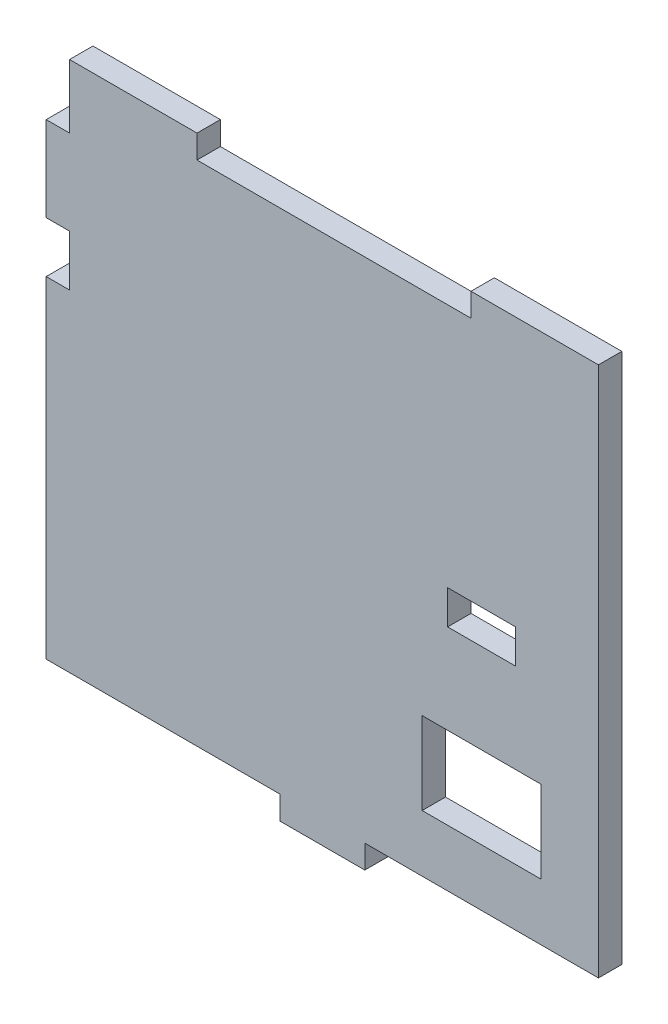
ISO-10303-21;
HEADER;
FILE_DESCRIPTION(('STEP AP214'),'2;1');
FILE_NAME('part.step','',(''),(''),'','','');
FILE_SCHEMA(('AUTOMOTIVE_DESIGN { 1 0 10303 214 1 1 1 1 }'));
ENDSEC;
DATA;
#1=APPLICATION_CONTEXT('core data for automotive mechanical design processes');
#2=APPLICATION_PROTOCOL_DEFINITION('international standard','automotive_design',2000,#1);
#3=PRODUCT_CONTEXT('',#1,'mechanical');
#4=PRODUCT('Part','Part','',(#3));
#5=PRODUCT_RELATED_PRODUCT_CATEGORY('part','',(#4));
#6=PRODUCT_DEFINITION_FORMATION('','',#4);
#7=PRODUCT_DEFINITION_CONTEXT('part definition',#1,'design');
#8=PRODUCT_DEFINITION('design','',#6,#7);
#9=PRODUCT_DEFINITION_SHAPE('','',#8);
#10=(LENGTH_UNIT() NAMED_UNIT(*) SI_UNIT(.MILLI.,.METRE.));
#11=(NAMED_UNIT(*) PLANE_ANGLE_UNIT() SI_UNIT($,.RADIAN.));
#12=(NAMED_UNIT(*) SI_UNIT($,.STERADIAN.) SOLID_ANGLE_UNIT());
#13=UNCERTAINTY_MEASURE_WITH_UNIT(LENGTH_MEASURE(1.E-05),#10,'distance_accuracy_value','');
#14=(GEOMETRIC_REPRESENTATION_CONTEXT(3) GLOBAL_UNCERTAINTY_ASSIGNED_CONTEXT((#13)) GLOBAL_UNIT_ASSIGNED_CONTEXT((#10,
#11,#12)) REPRESENTATION_CONTEXT('',''));
#15=CARTESIAN_POINT('',(0.,0.,0.));
#16=DIRECTION('',(0.,0.,1.));
#17=DIRECTION('',(1.,0.,0.));
#18=AXIS2_PLACEMENT_3D('',#15,#16,#17);
#19=CARTESIAN_POINT('',(0.,0.,5.5));
#20=DIRECTION('',(0.,0.,-1.));
#21=DIRECTION('',(-1.,0.,0.));
#22=AXIS2_PLACEMENT_3D('',#19,#20,#21);
#23=PLANE('',#22);
#24=DIRECTION('',(1.,0.,0.));
#25=VECTOR('',#24,1.);
#26=CARTESIAN_POINT('',(448.516438709158,17.4332232029367,5.5));
#27=LINE('',#26,#25);
#28=CARTESIAN_POINT('',(432.516438709158,17.4332232029367,5.5));
#29=VERTEX_POINT('',#28);
#30=CARTESIAN_POINT('',(448.516438709158,17.4332232029367,5.5));
#31=VERTEX_POINT('',#30);
#32=EDGE_CURVE('E242',#29,#31,#27,.T.);
#33=ORIENTED_EDGE('',*,*,#32,.F.);
#34=DIRECTION('',(0.,-1.,0.));
#35=VECTOR('',#34,1.);
#36=CARTESIAN_POINT('',(432.516438709158,17.4332232029367,5.5));
#37=LINE('',#36,#35);
#38=CARTESIAN_POINT('',(432.516438709158,25.4332232029367,5.5));
#39=VERTEX_POINT('',#38);
#40=EDGE_CURVE('E250',#39,#29,#37,.T.);
#41=ORIENTED_EDGE('',*,*,#40,.F.);
#42=DIRECTION('',(-1.,0.,0.));
#43=VECTOR('',#42,1.);
#44=CARTESIAN_POINT('',(432.516438709158,25.4332232029367,5.5));
#45=LINE('',#44,#43);
#46=CARTESIAN_POINT('',(448.516438709158,25.4332232029367,5.5));
#47=VERTEX_POINT('',#46);
#48=EDGE_CURVE('E247',#47,#39,#45,.T.);
#49=ORIENTED_EDGE('',*,*,#48,.F.);
#50=DIRECTION('',(0.,1.,0.));
#51=VECTOR('',#50,1.);
#52=CARTESIAN_POINT('',(448.516438709158,25.4332232029367,5.5));
#53=LINE('',#52,#51);
#54=EDGE_CURVE('E244',#31,#47,#53,.T.);
#55=ORIENTED_EDGE('',*,*,#54,.F.);
#56=EDGE_LOOP('',(#33,#41,#49,#55));
#57=FACE_BOUND('',#56,.T.);
#58=DIRECTION('',(0.,-1.,0.));
#59=VECTOR('',#58,1.);
#60=CARTESIAN_POINT('',(393.016438709158,-41.8917707150965,5.5));
#61=LINE('',#60,#59);
#62=CARTESIAN_POINT('',(393.016438709158,-36.3917707150965,5.5));
#63=VERTEX_POINT('',#62);
#64=CARTESIAN_POINT('',(393.016438709158,-41.8917707150965,5.5));
#65=VERTEX_POINT('',#64);
#66=EDGE_CURVE('E273',#63,#65,#61,.T.);
#67=ORIENTED_EDGE('',*,*,#66,.T.);
#68=DIRECTION('',(1.,0.,0.));
#69=VECTOR('',#68,1.);
#70=CARTESIAN_POINT('',(413.016438709158,-41.8917707150965,5.5));
#71=LINE('',#70,#69);
#72=CARTESIAN_POINT('',(413.016438709158,-41.8917707150965,5.5));
#73=VERTEX_POINT('',#72);
#74=EDGE_CURVE('E276',#65,#73,#71,.T.);
#75=ORIENTED_EDGE('',*,*,#74,.T.);
#76=DIRECTION('',(0.,1.,0.));
#77=VECTOR('',#76,1.);
#78=CARTESIAN_POINT('',(413.016438709158,-41.8917707150965,5.5));
#79=LINE('',#78,#77);
#80=CARTESIAN_POINT('',(413.016438709158,-36.3917707150965,5.5));
#81=VERTEX_POINT('',#80);
#82=EDGE_CURVE('E279',#73,#81,#79,.T.);
#83=ORIENTED_EDGE('',*,*,#82,.T.);
#84=DIRECTION('',(1.,0.,0.));
#85=VECTOR('',#84,1.);
#86=CARTESIAN_POINT('',(413.016438709158,-36.3917707150965,5.5));
#87=LINE('',#86,#85);
#88=CARTESIAN_POINT('',(468.016438709158,-36.3917707150965,5.5));
#89=VERTEX_POINT('',#88);
#90=EDGE_CURVE('E281',#81,#89,#87,.T.);
#91=ORIENTED_EDGE('',*,*,#90,.T.);
#92=DIRECTION('',(0.,1.,0.));
#93=VECTOR('',#92,1.);
#94=CARTESIAN_POINT('',(468.016438709158,88.6082292849035,5.5));
#95=LINE('',#94,#93);
#96=CARTESIAN_POINT('',(468.016438709158,88.6082292849035,5.5));
#97=VERTEX_POINT('',#96);
#98=EDGE_CURVE('E283',#89,#97,#95,.T.);
#99=ORIENTED_EDGE('',*,*,#98,.T.);
#100=DIRECTION('',(-1.,0.,0.));
#101=VECTOR('',#100,1.);
#102=CARTESIAN_POINT('',(438.016438709159,88.6082292849035,5.5));
#103=LINE('',#102,#101);
#104=CARTESIAN_POINT('',(438.016438709159,88.6082292849035,5.5));
#105=VERTEX_POINT('',#104);
#106=EDGE_CURVE('E285',#97,#105,#103,.T.);
#107=ORIENTED_EDGE('',*,*,#106,.T.);
#108=DIRECTION('',(0.,-1.,0.));
#109=VECTOR('',#108,1.);
#110=CARTESIAN_POINT('',(438.016438709159,83.1082292849035,5.5));
#111=LINE('',#110,#109);
#112=CARTESIAN_POINT('',(438.016438709159,83.1082292849035,5.5));
#113=VERTEX_POINT('',#112);
#114=EDGE_CURVE('E287',#105,#113,#111,.T.);
#115=ORIENTED_EDGE('',*,*,#114,.T.);
#116=DIRECTION('',(-1.,0.,0.));
#117=VECTOR('',#116,1.);
#118=CARTESIAN_POINT('',(438.016438709159,83.1082292849035,5.5));
#119=LINE('',#118,#117);
#120=CARTESIAN_POINT('',(373.516438709158,83.1082292849035,5.5));
#121=VERTEX_POINT('',#120);
#122=EDGE_CURVE('E289',#113,#121,#119,.T.);
#123=ORIENTED_EDGE('',*,*,#122,.T.);
#124=DIRECTION('',(0.,1.,0.));
#125=VECTOR('',#124,1.);
#126=CARTESIAN_POINT('',(373.516438709158,83.1082292849035,5.5));
#127=LINE('',#126,#125);
#128=CARTESIAN_POINT('',(373.516438709158,88.6082292849035,5.5));
#129=VERTEX_POINT('',#128);
#130=EDGE_CURVE('E291',#121,#129,#127,.T.);
#131=ORIENTED_EDGE('',*,*,#130,.T.);
#132=DIRECTION('',(-1.,0.,0.));
#133=VECTOR('',#132,1.);
#134=CARTESIAN_POINT('',(343.516438709158,88.6082292849035,5.5));
#135=LINE('',#134,#133);
#136=CARTESIAN_POINT('',(343.516438709158,88.6082292849035,5.5));
#137=VERTEX_POINT('',#136);
#138=EDGE_CURVE('E293',#129,#137,#135,.T.);
#139=ORIENTED_EDGE('',*,*,#138,.T.);
#140=DIRECTION('',(0.,-1.,0.));
#141=VECTOR('',#140,1.);
#142=CARTESIAN_POINT('',(343.516438709158,73.6082292849035,5.5));
#143=LINE('',#142,#141);
#144=CARTESIAN_POINT('',(343.516438709158,73.6082292849035,5.5));
#145=VERTEX_POINT('',#144);
#146=EDGE_CURVE('E295',#137,#145,#143,.T.);
#147=ORIENTED_EDGE('',*,*,#146,.T.);
#148=DIRECTION('',(-1.,0.,0.));
#149=VECTOR('',#148,1.);
#150=CARTESIAN_POINT('',(338.016438709158,73.6082292849035,5.5));
#151=LINE('',#150,#149);
#152=CARTESIAN_POINT('',(338.016438709158,73.6082292849035,5.5));
#153=VERTEX_POINT('',#152);
#154=EDGE_CURVE('E297',#145,#153,#151,.T.);
#155=ORIENTED_EDGE('',*,*,#154,.T.);
#156=DIRECTION('',(0.,-1.,0.));
#157=VECTOR('',#156,1.);
#158=CARTESIAN_POINT('',(338.016438709158,73.6082292849035,5.5));
#159=LINE('',#158,#157);
#160=CARTESIAN_POINT('',(338.016438709158,53.6082292849035,5.5));
#161=VERTEX_POINT('',#160);
#162=EDGE_CURVE('E299',#153,#161,#159,.T.);
#163=ORIENTED_EDGE('',*,*,#162,.T.);
#164=DIRECTION('',(1.,0.,0.));
#165=VECTOR('',#164,1.);
#166=CARTESIAN_POINT('',(338.016438709158,53.6082292849035,5.5));
#167=LINE('',#166,#165);
#168=CARTESIAN_POINT('',(343.516438709158,53.6082292849035,5.5));
#169=VERTEX_POINT('',#168);
#170=EDGE_CURVE('E301',#161,#169,#167,.T.);
#171=ORIENTED_EDGE('',*,*,#170,.T.);
#172=DIRECTION('',(0.,-1.,0.));
#173=VECTOR('',#172,1.);
#174=CARTESIAN_POINT('',(343.516438709158,53.6082292849035,5.5));
#175=LINE('',#174,#173);
#176=CARTESIAN_POINT('',(343.516438709158,41.6082292849035,5.5));
#177=VERTEX_POINT('',#176);
#178=EDGE_CURVE('E303',#169,#177,#175,.T.);
#179=ORIENTED_EDGE('',*,*,#178,.T.);
#180=DIRECTION('',(-1.,0.,0.));
#181=VECTOR('',#180,1.);
#182=CARTESIAN_POINT('',(343.516438709158,41.6082292849035,5.5));
#183=LINE('',#182,#181);
#184=CARTESIAN_POINT('',(338.016438709158,41.6082292849035,5.5));
#185=VERTEX_POINT('',#184);
#186=EDGE_CURVE('E305',#177,#185,#183,.T.);
#187=ORIENTED_EDGE('',*,*,#186,.T.);
#188=DIRECTION('',(0.,-1.,0.));
#189=VECTOR('',#188,1.);
#190=CARTESIAN_POINT('',(338.016438709158,41.6082292849035,5.5));
#191=LINE('',#190,#189);
#192=CARTESIAN_POINT('',(338.016438709158,-36.3917707150965,5.5));
#193=VERTEX_POINT('',#192);
#194=EDGE_CURVE('E307',#185,#193,#191,.T.);
#195=ORIENTED_EDGE('',*,*,#194,.T.);
#196=DIRECTION('',(1.,0.,0.));
#197=VECTOR('',#196,1.);
#198=CARTESIAN_POINT('',(338.016438709158,-36.3917707150965,5.5));
#199=LINE('',#198,#197);
#200=EDGE_CURVE('E309',#193,#63,#199,.T.);
#201=ORIENTED_EDGE('',*,*,#200,.T.);
#202=EDGE_LOOP('',(#67,#75,#83,#91,#99,#107,#115,#123,#131,#139,#147,#155,#163,#171,#179,#187,
#195,#201));
#203=FACE_BOUND('',#202,.T.);
#204=DIRECTION('',(0.,-1.,0.));
#205=VECTOR('',#204,1.);
#206=CARTESIAN_POINT('',(426.516438709158,-3.65,5.5));
#207=LINE('',#206,#205);
#208=CARTESIAN_POINT('',(426.516438709158,-3.65,5.5));
#209=VERTEX_POINT('',#208);
#210=CARTESIAN_POINT('',(426.516438709158,-23.,5.5));
#211=VERTEX_POINT('',#210);
#212=EDGE_CURVE('E206',#209,#211,#207,.T.);
#213=ORIENTED_EDGE('',*,*,#212,.F.);
#214=DIRECTION('',(-1.,0.,0.));
#215=VECTOR('',#214,1.);
#216=CARTESIAN_POINT('',(426.516438709158,-3.65,5.5));
#217=LINE('',#216,#215);
#218=CARTESIAN_POINT('',(454.516438709158,-3.65,5.5));
#219=VERTEX_POINT('',#218);
#220=EDGE_CURVE('E228',#219,#209,#217,.T.);
#221=ORIENTED_EDGE('',*,*,#220,.F.);
#222=DIRECTION('',(0.,1.,0.));
#223=VECTOR('',#222,1.);
#224=CARTESIAN_POINT('',(454.516438709158,-23.,5.5));
#225=LINE('',#224,#223);
#226=CARTESIAN_POINT('',(454.516438709158,-23.,5.5));
#227=VERTEX_POINT('',#226);
#228=EDGE_CURVE('E226',#227,#219,#225,.T.);
#229=ORIENTED_EDGE('',*,*,#228,.F.);
#230=DIRECTION('',(1.,0.,0.));
#231=VECTOR('',#230,1.);
#232=CARTESIAN_POINT('',(426.516438709158,-23.,5.5));
#233=LINE('',#232,#231);
#234=EDGE_CURVE('E214',#211,#227,#233,.T.);
#235=ORIENTED_EDGE('',*,*,#234,.F.);
#236=EDGE_LOOP('',(#213,#221,#229,#235));
#237=FACE_BOUND('',#236,.T.);
#238=ADVANCED_FACE('F33',(#57,#203,#237),#23,.F.);
#239=CARTESIAN_POINT('',(0.,0.,0.));
#240=DIRECTION('',(0.,0.,-1.));
#241=DIRECTION('',(-1.,0.,0.));
#242=AXIS2_PLACEMENT_3D('',#239,#240,#241);
#243=PLANE('',#242);
#244=DIRECTION('',(0.,-1.,0.));
#245=VECTOR('',#244,1.);
#246=CARTESIAN_POINT('',(393.016438709158,-41.8917707150965,0.));
#247=LINE('',#246,#245);
#248=CARTESIAN_POINT('',(393.016438709158,-36.3917707150965,0.));
#249=VERTEX_POINT('',#248);
#250=CARTESIAN_POINT('',(393.016438709158,-41.8917707150965,0.));
#251=VERTEX_POINT('',#250);
#252=EDGE_CURVE('E272',#249,#251,#247,.T.);
#253=ORIENTED_EDGE('',*,*,#252,.F.);
#254=DIRECTION('',(1.,0.,0.));
#255=VECTOR('',#254,1.);
#256=CARTESIAN_POINT('',(338.016438709158,-36.3917707150965,0.));
#257=LINE('',#256,#255);
#258=CARTESIAN_POINT('',(338.016438709158,-36.3917707150965,0.));
#259=VERTEX_POINT('',#258);
#260=EDGE_CURVE('E277',#259,#249,#257,.T.);
#261=ORIENTED_EDGE('',*,*,#260,.F.);
#262=DIRECTION('',(0.,-1.,0.));
#263=VECTOR('',#262,1.);
#264=CARTESIAN_POINT('',(338.016438709158,41.6082292849035,0.));
#265=LINE('',#264,#263);
#266=CARTESIAN_POINT('',(338.016438709158,41.6082292849035,0.));
#267=VERTEX_POINT('',#266);
#268=EDGE_CURVE('E344',#267,#259,#265,.T.);
#269=ORIENTED_EDGE('',*,*,#268,.F.);
#270=DIRECTION('',(-1.,0.,0.));
#271=VECTOR('',#270,1.);
#272=CARTESIAN_POINT('',(343.516438709158,41.6082292849035,0.));
#273=LINE('',#272,#271);
#274=CARTESIAN_POINT('',(343.516438709158,41.6082292849035,0.));
#275=VERTEX_POINT('',#274);
#276=EDGE_CURVE('E342',#275,#267,#273,.T.);
#277=ORIENTED_EDGE('',*,*,#276,.F.);
#278=DIRECTION('',(0.,-1.,0.));
#279=VECTOR('',#278,1.);
#280=CARTESIAN_POINT('',(343.516438709158,53.6082292849035,0.));
#281=LINE('',#280,#279);
#282=CARTESIAN_POINT('',(343.516438709158,53.6082292849035,0.));
#283=VERTEX_POINT('',#282);
#284=EDGE_CURVE('E340',#283,#275,#281,.T.);
#285=ORIENTED_EDGE('',*,*,#284,.F.);
#286=DIRECTION('',(1.,0.,0.));
#287=VECTOR('',#286,1.);
#288=CARTESIAN_POINT('',(338.016438709158,53.6082292849035,0.));
#289=LINE('',#288,#287);
#290=CARTESIAN_POINT('',(338.016438709158,53.6082292849035,0.));
#291=VERTEX_POINT('',#290);
#292=EDGE_CURVE('E338',#291,#283,#289,.T.);
#293=ORIENTED_EDGE('',*,*,#292,.F.);
#294=DIRECTION('',(0.,-1.,0.));
#295=VECTOR('',#294,1.);
#296=CARTESIAN_POINT('',(338.016438709158,73.6082292849035,0.));
#297=LINE('',#296,#295);
#298=CARTESIAN_POINT('',(338.016438709158,73.6082292849035,0.));
#299=VERTEX_POINT('',#298);
#300=EDGE_CURVE('E336',#299,#291,#297,.T.);
#301=ORIENTED_EDGE('',*,*,#300,.F.);
#302=DIRECTION('',(-1.,0.,0.));
#303=VECTOR('',#302,1.);
#304=CARTESIAN_POINT('',(338.016438709158,73.6082292849035,0.));
#305=LINE('',#304,#303);
#306=CARTESIAN_POINT('',(343.516438709158,73.6082292849035,0.));
#307=VERTEX_POINT('',#306);
#308=EDGE_CURVE('E334',#307,#299,#305,.T.);
#309=ORIENTED_EDGE('',*,*,#308,.F.);
#310=DIRECTION('',(0.,-1.,0.));
#311=VECTOR('',#310,1.);
#312=CARTESIAN_POINT('',(343.516438709158,73.6082292849035,0.));
#313=LINE('',#312,#311);
#314=CARTESIAN_POINT('',(343.516438709158,88.6082292849035,0.));
#315=VERTEX_POINT('',#314);
#316=EDGE_CURVE('E332',#315,#307,#313,.T.);
#317=ORIENTED_EDGE('',*,*,#316,.F.);
#318=DIRECTION('',(-1.,0.,0.));
#319=VECTOR('',#318,1.);
#320=CARTESIAN_POINT('',(343.516438709158,88.6082292849035,0.));
#321=LINE('',#320,#319);
#322=CARTESIAN_POINT('',(373.516438709158,88.6082292849035,0.));
#323=VERTEX_POINT('',#322);
#324=EDGE_CURVE('E330',#323,#315,#321,.T.);
#325=ORIENTED_EDGE('',*,*,#324,.F.);
#326=DIRECTION('',(0.,1.,0.));
#327=VECTOR('',#326,1.);
#328=CARTESIAN_POINT('',(373.516438709158,83.1082292849035,0.));
#329=LINE('',#328,#327);
#330=CARTESIAN_POINT('',(373.516438709158,83.1082292849035,0.));
#331=VERTEX_POINT('',#330);
#332=EDGE_CURVE('E328',#331,#323,#329,.T.);
#333=ORIENTED_EDGE('',*,*,#332,.F.);
#334=DIRECTION('',(-1.,0.,0.));
#335=VECTOR('',#334,1.);
#336=CARTESIAN_POINT('',(438.016438709159,83.1082292849035,0.));
#337=LINE('',#336,#335);
#338=CARTESIAN_POINT('',(438.016438709159,83.1082292849035,0.));
#339=VERTEX_POINT('',#338);
#340=EDGE_CURVE('E326',#339,#331,#337,.T.);
#341=ORIENTED_EDGE('',*,*,#340,.F.);
#342=DIRECTION('',(0.,-1.,0.));
#343=VECTOR('',#342,1.);
#344=CARTESIAN_POINT('',(438.016438709159,83.1082292849035,0.));
#345=LINE('',#344,#343);
#346=CARTESIAN_POINT('',(438.016438709159,88.6082292849035,0.));
#347=VERTEX_POINT('',#346);
#348=EDGE_CURVE('E324',#347,#339,#345,.T.);
#349=ORIENTED_EDGE('',*,*,#348,.F.);
#350=DIRECTION('',(-1.,0.,0.));
#351=VECTOR('',#350,1.);
#352=CARTESIAN_POINT('',(438.016438709159,88.6082292849035,0.));
#353=LINE('',#352,#351);
#354=CARTESIAN_POINT('',(468.016438709158,88.6082292849035,0.));
#355=VERTEX_POINT('',#354);
#356=EDGE_CURVE('E322',#355,#347,#353,.T.);
#357=ORIENTED_EDGE('',*,*,#356,.F.);
#358=DIRECTION('',(0.,1.,0.));
#359=VECTOR('',#358,1.);
#360=CARTESIAN_POINT('',(468.016438709158,88.6082292849035,0.));
#361=LINE('',#360,#359);
#362=CARTESIAN_POINT('',(468.016438709158,-36.3917707150965,0.));
#363=VERTEX_POINT('',#362);
#364=EDGE_CURVE('E320',#363,#355,#361,.T.);
#365=ORIENTED_EDGE('',*,*,#364,.F.);
#366=DIRECTION('',(1.,0.,0.));
#367=VECTOR('',#366,1.);
#368=CARTESIAN_POINT('',(413.016438709158,-36.3917707150965,0.));
#369=LINE('',#368,#367);
#370=CARTESIAN_POINT('',(413.016438709158,-36.3917707150965,0.));
#371=VERTEX_POINT('',#370);
#372=EDGE_CURVE('E318',#371,#363,#369,.T.);
#373=ORIENTED_EDGE('',*,*,#372,.F.);
#374=DIRECTION('',(0.,1.,0.));
#375=VECTOR('',#374,1.);
#376=CARTESIAN_POINT('',(413.016438709158,-41.8917707150965,0.));
#377=LINE('',#376,#375);
#378=CARTESIAN_POINT('',(413.016438709158,-41.8917707150965,0.));
#379=VERTEX_POINT('',#378);
#380=EDGE_CURVE('E316',#379,#371,#377,.T.);
#381=ORIENTED_EDGE('',*,*,#380,.F.);
#382=DIRECTION('',(1.,0.,0.));
#383=VECTOR('',#382,1.);
#384=CARTESIAN_POINT('',(413.016438709158,-41.8917707150965,0.));
#385=LINE('',#384,#383);
#386=EDGE_CURVE('E314',#251,#379,#385,.T.);
#387=ORIENTED_EDGE('',*,*,#386,.F.);
#388=EDGE_LOOP('',(#253,#261,#269,#277,#285,#293,#301,#309,#317,#325,#333,#341,#349,#357,#365,
#373,#381,#387));
#389=FACE_BOUND('',#388,.T.);
#390=DIRECTION('',(0.,-1.,0.));
#391=VECTOR('',#390,1.);
#392=CARTESIAN_POINT('',(432.516438709158,17.4332232029367,0.));
#393=LINE('',#392,#391);
#394=CARTESIAN_POINT('',(432.516438709158,25.4332232029367,0.));
#395=VERTEX_POINT('',#394);
#396=CARTESIAN_POINT('',(432.516438709158,17.4332232029367,0.));
#397=VERTEX_POINT('',#396);
#398=EDGE_CURVE('E245',#395,#397,#393,.T.);
#399=ORIENTED_EDGE('',*,*,#398,.T.);
#400=DIRECTION('',(1.,0.,0.));
#401=VECTOR('',#400,1.);
#402=CARTESIAN_POINT('',(448.516438709158,17.4332232029367,0.));
#403=LINE('',#402,#401);
#404=CARTESIAN_POINT('',(448.516438709158,17.4332232029367,0.));
#405=VERTEX_POINT('',#404);
#406=EDGE_CURVE('E222',#397,#405,#403,.T.);
#407=ORIENTED_EDGE('',*,*,#406,.T.);
#408=DIRECTION('',(0.,1.,0.));
#409=VECTOR('',#408,1.);
#410=CARTESIAN_POINT('',(448.516438709158,25.4332232029367,0.));
#411=LINE('',#410,#409);
#412=CARTESIAN_POINT('',(448.516438709158,25.4332232029367,0.));
#413=VERTEX_POINT('',#412);
#414=EDGE_CURVE('E255',#405,#413,#411,.T.);
#415=ORIENTED_EDGE('',*,*,#414,.T.);
#416=DIRECTION('',(-1.,0.,0.));
#417=VECTOR('',#416,1.);
#418=CARTESIAN_POINT('',(432.516438709158,25.4332232029367,0.));
#419=LINE('',#418,#417);
#420=EDGE_CURVE('E258',#413,#395,#419,.T.);
#421=ORIENTED_EDGE('',*,*,#420,.T.);
#422=EDGE_LOOP('',(#399,#407,#415,#421));
#423=FACE_BOUND('',#422,.T.);
#424=DIRECTION('',(-1.,0.,0.));
#425=VECTOR('',#424,1.);
#426=CARTESIAN_POINT('',(426.516438709158,-3.65,0.));
#427=LINE('',#426,#425);
#428=CARTESIAN_POINT('',(454.516438709158,-3.65,0.));
#429=VERTEX_POINT('',#428);
#430=CARTESIAN_POINT('',(426.516438709158,-3.65,0.));
#431=VERTEX_POINT('',#430);
#432=EDGE_CURVE('E215',#429,#431,#427,.T.);
#433=ORIENTED_EDGE('',*,*,#432,.T.);
#434=DIRECTION('',(0.,-1.,0.));
#435=VECTOR('',#434,1.);
#436=CARTESIAN_POINT('',(426.516438709158,-3.65,0.));
#437=LINE('',#436,#435);
#438=CARTESIAN_POINT('',(426.516438709158,-23.,0.));
#439=VERTEX_POINT('',#438);
#440=EDGE_CURVE('E56',#431,#439,#437,.T.);
#441=ORIENTED_EDGE('',*,*,#440,.T.);
#442=DIRECTION('',(1.,0.,0.));
#443=VECTOR('',#442,1.);
#444=CARTESIAN_POINT('',(426.516438709158,-23.,0.));
#445=LINE('',#444,#443);
#446=CARTESIAN_POINT('',(454.516438709158,-23.,0.));
#447=VERTEX_POINT('',#446);
#448=EDGE_CURVE('E221',#439,#447,#445,.T.);
#449=ORIENTED_EDGE('',*,*,#448,.T.);
#450=DIRECTION('',(0.,1.,0.));
#451=VECTOR('',#450,1.);
#452=CARTESIAN_POINT('',(454.516438709158,-23.,0.));
#453=LINE('',#452,#451);
#454=EDGE_CURVE('E234',#447,#429,#453,.T.);
#455=ORIENTED_EDGE('',*,*,#454,.T.);
#456=EDGE_LOOP('',(#433,#441,#449,#455));
#457=FACE_BOUND('',#456,.T.);
#458=ADVANCED_FACE('F404',(#389,#423,#457),#243,.T.);
#459=CARTESIAN_POINT('',(393.016438709158,-41.8917707150965,5.5));
#460=DIRECTION('',(1.,0.,0.));
#461=DIRECTION('',(0.,0.,-1.));
#462=AXIS2_PLACEMENT_3D('',#459,#460,#461);
#463=PLANE('',#462);
#464=ORIENTED_EDGE('',*,*,#252,.T.);
#465=DIRECTION('',(0.,0.,-1.));
#466=VECTOR('',#465,1.);
#467=CARTESIAN_POINT('',(393.016438709158,-41.8917707150965,5.5));
#468=LINE('',#467,#466);
#469=EDGE_CURVE('E11',#65,#251,#468,.T.);
#470=ORIENTED_EDGE('',*,*,#469,.F.);
#471=ORIENTED_EDGE('',*,*,#66,.F.);
#472=DIRECTION('',(0.,0.,-1.));
#473=VECTOR('',#472,1.);
#474=CARTESIAN_POINT('',(393.016438709158,-36.3917707150965,5.5));
#475=LINE('',#474,#473);
#476=EDGE_CURVE('E311',#63,#249,#475,.T.);
#477=ORIENTED_EDGE('',*,*,#476,.T.);
#478=EDGE_LOOP('',(#464,#470,#471,#477));
#479=FACE_BOUND('',#478,.T.);
#480=ADVANCED_FACE('F35',(#479),#463,.F.);
#481=CARTESIAN_POINT('',(413.016438709158,-41.8917707150965,5.5));
#482=DIRECTION('',(0.,1.,0.));
#483=DIRECTION('',(0.,0.,1.));
#484=AXIS2_PLACEMENT_3D('',#481,#482,#483);
#485=PLANE('',#484);
#486=ORIENTED_EDGE('',*,*,#386,.T.);
#487=DIRECTION('',(0.,0.,-1.));
#488=VECTOR('',#487,1.);
#489=CARTESIAN_POINT('',(413.016438709158,-41.8917707150965,5.5));
#490=LINE('',#489,#488);
#491=EDGE_CURVE('E41',#73,#379,#490,.T.);
#492=ORIENTED_EDGE('',*,*,#491,.F.);
#493=ORIENTED_EDGE('',*,*,#74,.F.);
#494=ORIENTED_EDGE('',*,*,#469,.T.);
#495=EDGE_LOOP('',(#486,#492,#493,#494));
#496=FACE_BOUND('',#495,.T.);
#497=ADVANCED_FACE('F421',(#496),#485,.F.);
#498=CARTESIAN_POINT('',(413.016438709158,-41.8917707150965,5.5));
#499=DIRECTION('',(-1.,0.,0.));
#500=DIRECTION('',(0.,0.,1.));
#501=AXIS2_PLACEMENT_3D('',#498,#499,#500);
#502=PLANE('',#501);
#503=ORIENTED_EDGE('',*,*,#380,.T.);
#504=DIRECTION('',(0.,0.,-1.));
#505=VECTOR('',#504,1.);
#506=CARTESIAN_POINT('',(413.016438709158,-36.3917707150965,5.5));
#507=LINE('',#506,#505);
#508=EDGE_CURVE('E391',#81,#371,#507,.T.);
#509=ORIENTED_EDGE('',*,*,#508,.F.);
#510=ORIENTED_EDGE('',*,*,#82,.F.);
#511=ORIENTED_EDGE('',*,*,#491,.T.);
#512=EDGE_LOOP('',(#503,#509,#510,#511));
#513=FACE_BOUND('',#512,.T.);
#514=ADVANCED_FACE('F398',(#513),#502,.F.);
#515=CARTESIAN_POINT('',(413.016438709158,-36.3917707150965,5.5));
#516=DIRECTION('',(0.,1.,0.));
#517=DIRECTION('',(0.,0.,1.));
#518=AXIS2_PLACEMENT_3D('',#515,#516,#517);
#519=PLANE('',#518);
#520=ORIENTED_EDGE('',*,*,#372,.T.);
#521=DIRECTION('',(0.,0.,-1.));
#522=VECTOR('',#521,1.);
#523=CARTESIAN_POINT('',(468.016438709158,-36.3917707150965,5.5));
#524=LINE('',#523,#522);
#525=EDGE_CURVE('E388',#89,#363,#524,.T.);
#526=ORIENTED_EDGE('',*,*,#525,.F.);
#527=ORIENTED_EDGE('',*,*,#90,.F.);
#528=ORIENTED_EDGE('',*,*,#508,.T.);
#529=EDGE_LOOP('',(#520,#526,#527,#528));
#530=FACE_BOUND('',#529,.T.);
#531=ADVANCED_FACE('F410',(#530),#519,.F.);
#532=CARTESIAN_POINT('',(468.016438709158,88.6082292849035,5.5));
#533=DIRECTION('',(-1.,0.,0.));
#534=DIRECTION('',(0.,0.,1.));
#535=AXIS2_PLACEMENT_3D('',#532,#533,#534);
#536=PLANE('',#535);
#537=ORIENTED_EDGE('',*,*,#364,.T.);
#538=DIRECTION('',(0.,0.,-1.));
#539=VECTOR('',#538,1.);
#540=CARTESIAN_POINT('',(468.016438709158,88.6082292849035,5.5));
#541=LINE('',#540,#539);
#542=EDGE_CURVE('E385',#97,#355,#541,.T.);
#543=ORIENTED_EDGE('',*,*,#542,.F.);
#544=ORIENTED_EDGE('',*,*,#98,.F.);
#545=ORIENTED_EDGE('',*,*,#525,.T.);
#546=EDGE_LOOP('',(#537,#543,#544,#545));
#547=FACE_BOUND('',#546,.T.);
#548=ADVANCED_FACE('F414',(#547),#536,.F.);
#549=CARTESIAN_POINT('',(438.016438709159,88.6082292849035,5.5));
#550=DIRECTION('',(0.,-1.,0.));
#551=DIRECTION('',(0.,0.,-1.));
#552=AXIS2_PLACEMENT_3D('',#549,#550,#551);
#553=PLANE('',#552);
#554=ORIENTED_EDGE('',*,*,#356,.T.);
#555=DIRECTION('',(0.,0.,-1.));
#556=VECTOR('',#555,1.);
#557=CARTESIAN_POINT('',(438.016438709159,88.6082292849035,5.5));
#558=LINE('',#557,#556);
#559=EDGE_CURVE('E382',#105,#347,#558,.T.);
#560=ORIENTED_EDGE('',*,*,#559,.F.);
#561=ORIENTED_EDGE('',*,*,#106,.F.);
#562=ORIENTED_EDGE('',*,*,#542,.T.);
#563=EDGE_LOOP('',(#554,#560,#561,#562));
#564=FACE_BOUND('',#563,.T.);
#565=ADVANCED_FACE('F484',(#564),#553,.F.);
#566=CARTESIAN_POINT('',(438.016438709159,83.1082292849035,5.5));
#567=DIRECTION('',(1.,0.,0.));
#568=DIRECTION('',(0.,0.,-1.));
#569=AXIS2_PLACEMENT_3D('',#566,#567,#568);
#570=PLANE('',#569);
#571=ORIENTED_EDGE('',*,*,#348,.T.);
#572=DIRECTION('',(0.,0.,-1.));
#573=VECTOR('',#572,1.);
#574=CARTESIAN_POINT('',(438.016438709159,83.1082292849035,5.5));
#575=LINE('',#574,#573);
#576=EDGE_CURVE('E379',#113,#339,#575,.T.);
#577=ORIENTED_EDGE('',*,*,#576,.F.);
#578=ORIENTED_EDGE('',*,*,#114,.F.);
#579=ORIENTED_EDGE('',*,*,#559,.T.);
#580=EDGE_LOOP('',(#571,#577,#578,#579));
#581=FACE_BOUND('',#580,.T.);
#582=ADVANCED_FACE('F482',(#581),#570,.F.);
#583=CARTESIAN_POINT('',(438.016438709159,83.1082292849035,5.5));
#584=DIRECTION('',(0.,-1.,0.));
#585=DIRECTION('',(0.,0.,-1.));
#586=AXIS2_PLACEMENT_3D('',#583,#584,#585);
#587=PLANE('',#586);
#588=ORIENTED_EDGE('',*,*,#340,.T.);
#589=DIRECTION('',(0.,0.,-1.));
#590=VECTOR('',#589,1.);
#591=CARTESIAN_POINT('',(373.516438709158,83.1082292849035,5.5));
#592=LINE('',#591,#590);
#593=EDGE_CURVE('E376',#121,#331,#592,.T.);
#594=ORIENTED_EDGE('',*,*,#593,.F.);
#595=ORIENTED_EDGE('',*,*,#122,.F.);
#596=ORIENTED_EDGE('',*,*,#576,.T.);
#597=EDGE_LOOP('',(#588,#594,#595,#596));
#598=FACE_BOUND('',#597,.T.);
#599=ADVANCED_FACE('F478',(#598),#587,.F.);
#600=CARTESIAN_POINT('',(373.516438709158,83.1082292849035,5.5));
#601=DIRECTION('',(-1.,0.,0.));
#602=DIRECTION('',(0.,0.,1.));
#603=AXIS2_PLACEMENT_3D('',#600,#601,#602);
#604=PLANE('',#603);
#605=ORIENTED_EDGE('',*,*,#332,.T.);
#606=DIRECTION('',(0.,0.,-1.));
#607=VECTOR('',#606,1.);
#608=CARTESIAN_POINT('',(373.516438709158,88.6082292849035,5.5));
#609=LINE('',#608,#607);
#610=EDGE_CURVE('E373',#129,#323,#609,.T.);
#611=ORIENTED_EDGE('',*,*,#610,.F.);
#612=ORIENTED_EDGE('',*,*,#130,.F.);
#613=ORIENTED_EDGE('',*,*,#593,.T.);
#614=EDGE_LOOP('',(#605,#611,#612,#613));
#615=FACE_BOUND('',#614,.T.);
#616=ADVANCED_FACE('F473',(#615),#604,.F.);
#617=CARTESIAN_POINT('',(343.516438709158,88.6082292849035,5.5));
#618=DIRECTION('',(0.,-1.,0.));
#619=DIRECTION('',(0.,0.,-1.));
#620=AXIS2_PLACEMENT_3D('',#617,#618,#619);
#621=PLANE('',#620);
#622=ORIENTED_EDGE('',*,*,#324,.T.);
#623=DIRECTION('',(0.,0.,-1.));
#624=VECTOR('',#623,1.);
#625=CARTESIAN_POINT('',(343.516438709158,88.6082292849035,5.5));
#626=LINE('',#625,#624);
#627=EDGE_CURVE('E370',#137,#315,#626,.T.);
#628=ORIENTED_EDGE('',*,*,#627,.F.);
#629=ORIENTED_EDGE('',*,*,#138,.F.);
#630=ORIENTED_EDGE('',*,*,#610,.T.);
#631=EDGE_LOOP('',(#622,#628,#629,#630));
#632=FACE_BOUND('',#631,.T.);
#633=ADVANCED_FACE('F467',(#632),#621,.F.);
#634=CARTESIAN_POINT('',(343.516438709158,73.6082292849035,5.5));
#635=DIRECTION('',(1.,0.,0.));
#636=DIRECTION('',(0.,0.,-1.));
#637=AXIS2_PLACEMENT_3D('',#634,#635,#636);
#638=PLANE('',#637);
#639=ORIENTED_EDGE('',*,*,#316,.T.);
#640=DIRECTION('',(0.,0.,-1.));
#641=VECTOR('',#640,1.);
#642=CARTESIAN_POINT('',(343.516438709158,73.6082292849035,5.5));
#643=LINE('',#642,#641);
#644=EDGE_CURVE('E367',#145,#307,#643,.T.);
#645=ORIENTED_EDGE('',*,*,#644,.F.);
#646=ORIENTED_EDGE('',*,*,#146,.F.);
#647=ORIENTED_EDGE('',*,*,#627,.T.);
#648=EDGE_LOOP('',(#639,#645,#646,#647));
#649=FACE_BOUND('',#648,.T.);
#650=ADVANCED_FACE('F463',(#649),#638,.F.);
#651=CARTESIAN_POINT('',(338.016438709158,73.6082292849035,5.5));
#652=DIRECTION('',(0.,-1.,0.));
#653=DIRECTION('',(0.,0.,-1.));
#654=AXIS2_PLACEMENT_3D('',#651,#652,#653);
#655=PLANE('',#654);
#656=ORIENTED_EDGE('',*,*,#308,.T.);
#657=DIRECTION('',(0.,0.,-1.));
#658=VECTOR('',#657,1.);
#659=CARTESIAN_POINT('',(338.016438709158,73.6082292849035,5.5));
#660=LINE('',#659,#658);
#661=EDGE_CURVE('E364',#153,#299,#660,.T.);
#662=ORIENTED_EDGE('',*,*,#661,.F.);
#663=ORIENTED_EDGE('',*,*,#154,.F.);
#664=ORIENTED_EDGE('',*,*,#644,.T.);
#665=EDGE_LOOP('',(#656,#662,#663,#664));
#666=FACE_BOUND('',#665,.T.);
#667=ADVANCED_FACE('F458',(#666),#655,.F.);
#668=CARTESIAN_POINT('',(338.016438709158,73.6082292849035,5.5));
#669=DIRECTION('',(1.,0.,0.));
#670=DIRECTION('',(0.,0.,-1.));
#671=AXIS2_PLACEMENT_3D('',#668,#669,#670);
#672=PLANE('',#671);
#673=ORIENTED_EDGE('',*,*,#300,.T.);
#674=DIRECTION('',(0.,0.,-1.));
#675=VECTOR('',#674,1.);
#676=CARTESIAN_POINT('',(338.016438709158,53.6082292849035,5.5));
#677=LINE('',#676,#675);
#678=EDGE_CURVE('E361',#161,#291,#677,.T.);
#679=ORIENTED_EDGE('',*,*,#678,.F.);
#680=ORIENTED_EDGE('',*,*,#162,.F.);
#681=ORIENTED_EDGE('',*,*,#661,.T.);
#682=EDGE_LOOP('',(#673,#679,#680,#681));
#683=FACE_BOUND('',#682,.T.);
#684=ADVANCED_FACE('F452',(#683),#672,.F.);
#685=CARTESIAN_POINT('',(338.016438709158,53.6082292849035,5.5));
#686=DIRECTION('',(0.,1.,0.));
#687=DIRECTION('',(0.,0.,1.));
#688=AXIS2_PLACEMENT_3D('',#685,#686,#687);
#689=PLANE('',#688);
#690=ORIENTED_EDGE('',*,*,#292,.T.);
#691=DIRECTION('',(0.,0.,-1.));
#692=VECTOR('',#691,1.);
#693=CARTESIAN_POINT('',(343.516438709158,53.6082292849035,5.5));
#694=LINE('',#693,#692);
#695=EDGE_CURVE('E358',#169,#283,#694,.T.);
#696=ORIENTED_EDGE('',*,*,#695,.F.);
#697=ORIENTED_EDGE('',*,*,#170,.F.);
#698=ORIENTED_EDGE('',*,*,#678,.T.);
#699=EDGE_LOOP('',(#690,#696,#697,#698));
#700=FACE_BOUND('',#699,.T.);
#701=ADVANCED_FACE('F448',(#700),#689,.F.);
#702=CARTESIAN_POINT('',(343.516438709158,53.6082292849035,5.5));
#703=DIRECTION('',(1.,0.,0.));
#704=DIRECTION('',(0.,0.,-1.));
#705=AXIS2_PLACEMENT_3D('',#702,#703,#704);
#706=PLANE('',#705);
#707=ORIENTED_EDGE('',*,*,#284,.T.);
#708=DIRECTION('',(0.,0.,-1.));
#709=VECTOR('',#708,1.);
#710=CARTESIAN_POINT('',(343.516438709158,41.6082292849035,5.5));
#711=LINE('',#710,#709);
#712=EDGE_CURVE('E355',#177,#275,#711,.T.);
#713=ORIENTED_EDGE('',*,*,#712,.F.);
#714=ORIENTED_EDGE('',*,*,#178,.F.);
#715=ORIENTED_EDGE('',*,*,#695,.T.);
#716=EDGE_LOOP('',(#707,#713,#714,#715));
#717=FACE_BOUND('',#716,.T.);
#718=ADVANCED_FACE('F443',(#717),#706,.F.);
#719=CARTESIAN_POINT('',(343.516438709158,41.6082292849035,5.5));
#720=DIRECTION('',(0.,-1.,0.));
#721=DIRECTION('',(0.,0.,-1.));
#722=AXIS2_PLACEMENT_3D('',#719,#720,#721);
#723=PLANE('',#722);
#724=ORIENTED_EDGE('',*,*,#276,.T.);
#725=DIRECTION('',(0.,0.,-1.));
#726=VECTOR('',#725,1.);
#727=CARTESIAN_POINT('',(338.016438709158,41.6082292849035,5.5));
#728=LINE('',#727,#726);
#729=EDGE_CURVE('E352',#185,#267,#728,.T.);
#730=ORIENTED_EDGE('',*,*,#729,.F.);
#731=ORIENTED_EDGE('',*,*,#186,.F.);
#732=ORIENTED_EDGE('',*,*,#712,.T.);
#733=EDGE_LOOP('',(#724,#730,#731,#732));
#734=FACE_BOUND('',#733,.T.);
#735=ADVANCED_FACE('F437',(#734),#723,.F.);
#736=CARTESIAN_POINT('',(338.016438709158,41.6082292849035,5.5));
#737=DIRECTION('',(1.,0.,0.));
#738=DIRECTION('',(0.,0.,-1.));
#739=AXIS2_PLACEMENT_3D('',#736,#737,#738);
#740=PLANE('',#739);
#741=ORIENTED_EDGE('',*,*,#268,.T.);
#742=DIRECTION('',(0.,0.,-1.));
#743=VECTOR('',#742,1.);
#744=CARTESIAN_POINT('',(338.016438709158,-36.3917707150965,5.5));
#745=LINE('',#744,#743);
#746=EDGE_CURVE('E349',#193,#259,#745,.T.);
#747=ORIENTED_EDGE('',*,*,#746,.F.);
#748=ORIENTED_EDGE('',*,*,#194,.F.);
#749=ORIENTED_EDGE('',*,*,#729,.T.);
#750=EDGE_LOOP('',(#741,#747,#748,#749));
#751=FACE_BOUND('',#750,.T.);
#752=ADVANCED_FACE('F433',(#751),#740,.F.);
#753=CARTESIAN_POINT('',(338.016438709158,-36.3917707150965,5.5));
#754=DIRECTION('',(0.,1.,0.));
#755=DIRECTION('',(0.,0.,1.));
#756=AXIS2_PLACEMENT_3D('',#753,#754,#755);
#757=PLANE('',#756);
#758=ORIENTED_EDGE('',*,*,#260,.T.);
#759=ORIENTED_EDGE('',*,*,#476,.F.);
#760=ORIENTED_EDGE('',*,*,#200,.F.);
#761=ORIENTED_EDGE('',*,*,#746,.T.);
#762=EDGE_LOOP('',(#758,#759,#760,#761));
#763=FACE_BOUND('',#762,.T.);
#764=ADVANCED_FACE('F428',(#763),#757,.F.);
#765=CARTESIAN_POINT('',(448.516438709158,17.4332232029367,5.5));
#766=DIRECTION('',(0.,1.,0.));
#767=DIRECTION('',(-1.,0.,0.));
#768=AXIS2_PLACEMENT_3D('',#765,#766,#767);
#769=PLANE('',#768);
#770=ORIENTED_EDGE('',*,*,#406,.F.);
#771=DIRECTION('',(0.,0.,-1.));
#772=VECTOR('',#771,1.);
#773=CARTESIAN_POINT('',(432.516438709158,17.4332232029367,5.5));
#774=LINE('',#773,#772);
#775=EDGE_CURVE('E252',#29,#397,#774,.T.);
#776=ORIENTED_EDGE('',*,*,#775,.F.);
#777=ORIENTED_EDGE('',*,*,#32,.T.);
#778=DIRECTION('',(0.,0.,-1.));
#779=VECTOR('',#778,1.);
#780=CARTESIAN_POINT('',(448.516438709158,17.4332232029367,5.5));
#781=LINE('',#780,#779);
#782=EDGE_CURVE('E269',#31,#405,#781,.T.);
#783=ORIENTED_EDGE('',*,*,#782,.T.);
#784=EDGE_LOOP('',(#770,#776,#777,#783));
#785=FACE_BOUND('',#784,.T.);
#786=ADVANCED_FACE('F502',(#785),#769,.T.);
#787=CARTESIAN_POINT('',(448.516438709158,25.4332232029367,5.5));
#788=DIRECTION('',(-1.,0.,0.));
#789=DIRECTION('',(0.,0.,1.));
#790=AXIS2_PLACEMENT_3D('',#787,#788,#789);
#791=PLANE('',#790);
#792=ORIENTED_EDGE('',*,*,#414,.F.);
#793=ORIENTED_EDGE('',*,*,#782,.F.);
#794=ORIENTED_EDGE('',*,*,#54,.T.);
#795=DIRECTION('',(0.,0.,-1.));
#796=VECTOR('',#795,1.);
#797=CARTESIAN_POINT('',(448.516438709158,25.4332232029367,5.5));
#798=LINE('',#797,#796);
#799=EDGE_CURVE('E267',#47,#413,#798,.T.);
#800=ORIENTED_EDGE('',*,*,#799,.T.);
#801=EDGE_LOOP('',(#792,#793,#794,#800));
#802=FACE_BOUND('',#801,.T.);
#803=ADVANCED_FACE('F576',(#802),#791,.T.);
#804=CARTESIAN_POINT('',(432.516438709158,25.4332232029367,5.5));
#805=DIRECTION('',(0.,-1.,0.));
#806=DIRECTION('',(1.,0.,0.));
#807=AXIS2_PLACEMENT_3D('',#804,#805,#806);
#808=PLANE('',#807);
#809=ORIENTED_EDGE('',*,*,#420,.F.);
#810=ORIENTED_EDGE('',*,*,#799,.F.);
#811=ORIENTED_EDGE('',*,*,#48,.T.);
#812=DIRECTION('',(0.,0.,-1.));
#813=VECTOR('',#812,1.);
#814=CARTESIAN_POINT('',(432.516438709158,25.4332232029367,5.5));
#815=LINE('',#814,#813);
#816=EDGE_CURVE('E265',#39,#395,#815,.T.);
#817=ORIENTED_EDGE('',*,*,#816,.T.);
#818=EDGE_LOOP('',(#809,#810,#811,#817));
#819=FACE_BOUND('',#818,.T.);
#820=ADVANCED_FACE('F583',(#819),#808,.T.);
#821=CARTESIAN_POINT('',(432.516438709158,17.4332232029367,5.5));
#822=DIRECTION('',(1.,0.,0.));
#823=DIRECTION('',(0.,0.,-1.));
#824=AXIS2_PLACEMENT_3D('',#821,#822,#823);
#825=PLANE('',#824);
#826=ORIENTED_EDGE('',*,*,#398,.F.);
#827=ORIENTED_EDGE('',*,*,#816,.F.);
#828=ORIENTED_EDGE('',*,*,#40,.T.);
#829=ORIENTED_EDGE('',*,*,#775,.T.);
#830=EDGE_LOOP('',(#826,#827,#828,#829));
#831=FACE_BOUND('',#830,.T.);
#832=ADVANCED_FACE('F590',(#831),#825,.T.);
#833=CARTESIAN_POINT('',(426.516438709158,-3.65,5.5));
#834=DIRECTION('',(1.,0.,0.));
#835=DIRECTION('',(0.,0.,-1.));
#836=AXIS2_PLACEMENT_3D('',#833,#834,#835);
#837=PLANE('',#836);
#838=ORIENTED_EDGE('',*,*,#440,.F.);
#839=DIRECTION('',(0.,0.,-1.));
#840=VECTOR('',#839,1.);
#841=CARTESIAN_POINT('',(426.516438709158,-3.65,5.5));
#842=LINE('',#841,#840);
#843=EDGE_CURVE('E210',#209,#431,#842,.T.);
#844=ORIENTED_EDGE('',*,*,#843,.F.);
#845=ORIENTED_EDGE('',*,*,#212,.T.);
#846=DIRECTION('',(0.,0.,-1.));
#847=VECTOR('',#846,1.);
#848=CARTESIAN_POINT('',(426.516438709158,-23.,5.5));
#849=LINE('',#848,#847);
#850=EDGE_CURVE('E209',#211,#439,#849,.T.);
#851=ORIENTED_EDGE('',*,*,#850,.T.);
#852=EDGE_LOOP('',(#838,#844,#845,#851));
#853=FACE_BOUND('',#852,.T.);
#854=ADVANCED_FACE('F208',(#853),#837,.T.);
#855=CARTESIAN_POINT('',(426.516438709158,-23.,5.5));
#856=DIRECTION('',(0.,1.,0.));
#857=DIRECTION('',(0.,0.,1.));
#858=AXIS2_PLACEMENT_3D('',#855,#856,#857);
#859=PLANE('',#858);
#860=ORIENTED_EDGE('',*,*,#448,.F.);
#861=ORIENTED_EDGE('',*,*,#850,.F.);
#862=ORIENTED_EDGE('',*,*,#234,.T.);
#863=DIRECTION('',(0.,0.,-1.));
#864=VECTOR('',#863,1.);
#865=CARTESIAN_POINT('',(454.516438709158,-23.,5.5));
#866=LINE('',#865,#864);
#867=EDGE_CURVE('E223',#227,#447,#866,.T.);
#868=ORIENTED_EDGE('',*,*,#867,.T.);
#869=EDGE_LOOP('',(#860,#861,#862,#868));
#870=FACE_BOUND('',#869,.T.);
#871=ADVANCED_FACE('F218',(#870),#859,.T.);
#872=CARTESIAN_POINT('',(454.516438709158,-23.,5.5));
#873=DIRECTION('',(-1.,0.,0.));
#874=DIRECTION('',(0.,0.,1.));
#875=AXIS2_PLACEMENT_3D('',#872,#873,#874);
#876=PLANE('',#875);
#877=ORIENTED_EDGE('',*,*,#454,.F.);
#878=ORIENTED_EDGE('',*,*,#867,.F.);
#879=ORIENTED_EDGE('',*,*,#228,.T.);
#880=DIRECTION('',(0.,0.,-1.));
#881=VECTOR('',#880,1.);
#882=CARTESIAN_POINT('',(454.516438709158,-3.65,5.5));
#883=LINE('',#882,#881);
#884=EDGE_CURVE('E48',#219,#429,#883,.T.);
#885=ORIENTED_EDGE('',*,*,#884,.T.);
#886=EDGE_LOOP('',(#877,#878,#879,#885));
#887=FACE_BOUND('',#886,.T.);
#888=ADVANCED_FACE('F611',(#887),#876,.T.);
#889=CARTESIAN_POINT('',(426.516438709158,-3.65,5.5));
#890=DIRECTION('',(0.,-1.,0.));
#891=DIRECTION('',(0.,0.,-1.));
#892=AXIS2_PLACEMENT_3D('',#889,#890,#891);
#893=PLANE('',#892);
#894=ORIENTED_EDGE('',*,*,#432,.F.);
#895=ORIENTED_EDGE('',*,*,#884,.F.);
#896=ORIENTED_EDGE('',*,*,#220,.T.);
#897=ORIENTED_EDGE('',*,*,#843,.T.);
#898=EDGE_LOOP('',(#894,#895,#896,#897));
#899=FACE_BOUND('',#898,.T.);
#900=ADVANCED_FACE('F618',(#899),#893,.T.);
#901=CLOSED_SHELL('',(#238,#458,#480,#497,#514,#531,#548,#565,#582,#599,#616,#633,#650,#667,
#684,#701,#718,#735,#752,#764,#786,#803,#820,#832,#854,#871,#888,#900));
#902=MANIFOLD_SOLID_BREP('B2',#901);
#903=ADVANCED_BREP_SHAPE_REPRESENTATION('',(#18,#902),#14);
#904=SHAPE_DEFINITION_REPRESENTATION(#9,#903);
ENDSEC;
END-ISO-10303-21;
